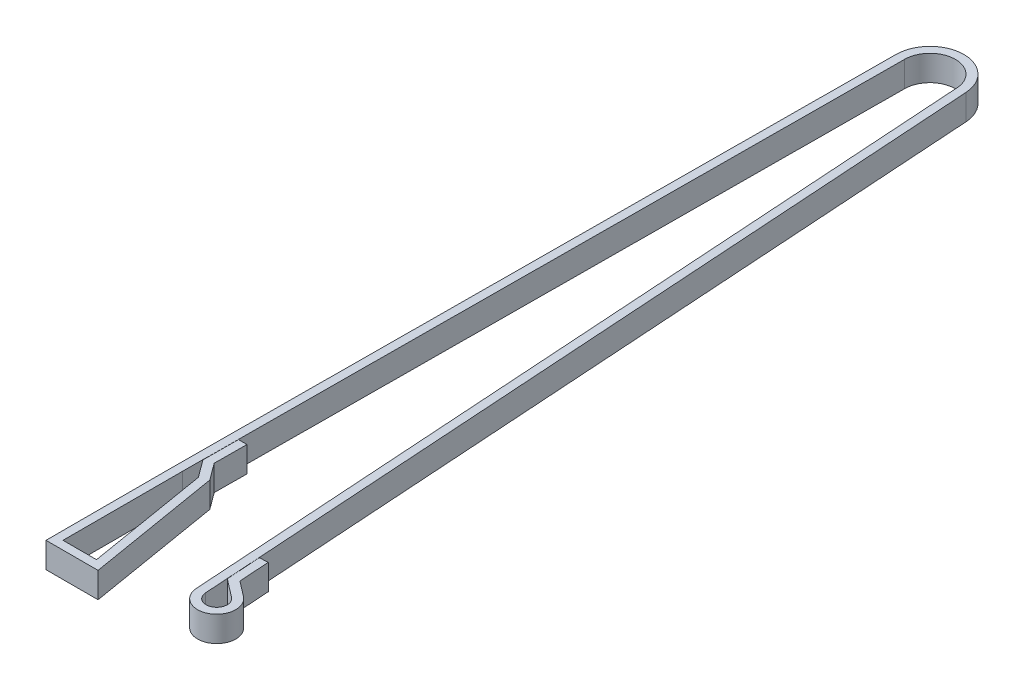
ISO-10303-21;
HEADER;
FILE_DESCRIPTION(('STEP AP214'),'2;1');
FILE_NAME('part.step','',(''),(''),'','','');
FILE_SCHEMA(('AUTOMOTIVE_DESIGN { 1 0 10303 214 1 1 1 1 }'));
ENDSEC;
DATA;
#1=APPLICATION_CONTEXT('core data for automotive mechanical design processes');
#2=APPLICATION_PROTOCOL_DEFINITION('international standard','automotive_design',2000,#1);
#3=PRODUCT_CONTEXT('',#1,'mechanical');
#4=PRODUCT('Part','Part','',(#3));
#5=PRODUCT_RELATED_PRODUCT_CATEGORY('part','',(#4));
#6=PRODUCT_DEFINITION_FORMATION('','',#4);
#7=PRODUCT_DEFINITION_CONTEXT('part definition',#1,'design');
#8=PRODUCT_DEFINITION('design','',#6,#7);
#9=PRODUCT_DEFINITION_SHAPE('','',#8);
#10=(LENGTH_UNIT() NAMED_UNIT(*) SI_UNIT(.MILLI.,.METRE.));
#11=(NAMED_UNIT(*) PLANE_ANGLE_UNIT() SI_UNIT($,.RADIAN.));
#12=(NAMED_UNIT(*) SI_UNIT($,.STERADIAN.) SOLID_ANGLE_UNIT());
#13=UNCERTAINTY_MEASURE_WITH_UNIT(LENGTH_MEASURE(1.E-05),#10,'distance_accuracy_value','');
#14=(GEOMETRIC_REPRESENTATION_CONTEXT(3) GLOBAL_UNCERTAINTY_ASSIGNED_CONTEXT((#13)) GLOBAL_UNIT_ASSIGNED_CONTEXT((#10,
#11,#12)) REPRESENTATION_CONTEXT('',''));
#15=CARTESIAN_POINT('',(0.,0.,0.));
#16=DIRECTION('',(0.,0.,1.));
#17=DIRECTION('',(1.,0.,0.));
#18=AXIS2_PLACEMENT_3D('',#15,#16,#17);
#19=CARTESIAN_POINT('',(3.07964569401571,-3.,-5.00171368797975));
#20=DIRECTION('',(0.99998249835892,0.,0.00591633128326256));
#21=DIRECTION('',(0.00591633128326256,0.,-0.99998249835892));
#22=AXIS2_PLACEMENT_3D('',#19,#20,#21);
#23=PLANE('',#22);
#24=DIRECTION('',(0.,1.,0.));
#25=VECTOR('',#24,1.);
#26=CARTESIAN_POINT('',(3.12697717266036,-3.,-13.0017136879798));
#27=LINE('',#26,#25);
#28=CARTESIAN_POINT('',(3.12697717266036,-3.,-13.0017136879798));
#29=VERTEX_POINT('',#28);
#30=CARTESIAN_POINT('',(3.12697717266036,3.,-13.0017136879798));
#31=VERTEX_POINT('',#30);
#32=EDGE_CURVE('E40',#29,#31,#27,.T.);
#33=ORIENTED_EDGE('',*,*,#32,.T.);
#34=DIRECTION('',(0.00591633128326256,0.,-0.99998249835892));
#35=VECTOR('',#34,1.);
#36=CARTESIAN_POINT('',(3.07964569401571,3.,-5.00171368797975));
#37=LINE('',#36,#35);
#38=CARTESIAN_POINT('',(3.08161084289808,3.,-5.33386454210851));
#39=VERTEX_POINT('',#38);
#40=EDGE_CURVE('E197',#39,#31,#37,.T.);
#41=ORIENTED_EDGE('',*,*,#40,.F.);
#42=DIRECTION('',(0.,1.,0.));
#43=VECTOR('',#42,1.);
#44=CARTESIAN_POINT('',(3.08161084289808,-3.,-5.33386454210851));
#45=LINE('',#44,#43);
#46=CARTESIAN_POINT('',(3.08161084289808,-3.,-5.33386454210851));
#47=VERTEX_POINT('',#46);
#48=EDGE_CURVE('E11',#47,#39,#45,.T.);
#49=ORIENTED_EDGE('',*,*,#48,.F.);
#50=DIRECTION('',(0.00591633128326256,0.,-0.99998249835892));
#51=VECTOR('',#50,1.);
#52=CARTESIAN_POINT('',(3.07964569401571,-3.,-5.00171368797975));
#53=LINE('',#52,#51);
#54=EDGE_CURVE('E198',#47,#29,#53,.T.);
#55=ORIENTED_EDGE('',*,*,#54,.T.);
#56=EDGE_LOOP('',(#33,#41,#49,#55));
#57=FACE_BOUND('',#56,.T.);
#58=ADVANCED_FACE('F37',(#57),#23,.T.);
#59=CARTESIAN_POINT('',(2.88445838565668,-3.,-5.60118263037093));
#60=DIRECTION('',(0.804795189999899,0.,-0.593552611107917));
#61=DIRECTION('',(-0.593552611107917,0.,-0.804795189999899));
#62=AXIS2_PLACEMENT_3D('',#59,#60,#61);
#63=PLANE('',#62);
#64=ORIENTED_EDGE('',*,*,#48,.T.);
#65=DIRECTION('',(-0.593552611107917,0.,-0.804795189999899));
#66=VECTOR('',#65,1.);
#67=CARTESIAN_POINT('',(2.88445838565668,3.,-5.60118263037093));
#68=LINE('',#67,#66);
#69=CARTESIAN_POINT('',(5.99443158082216,3.,-1.384384621807));
#70=VERTEX_POINT('',#69);
#71=EDGE_CURVE('E212',#70,#39,#68,.T.);
#72=ORIENTED_EDGE('',*,*,#71,.F.);
#73=DIRECTION('',(0.,1.,0.));
#74=VECTOR('',#73,1.);
#75=CARTESIAN_POINT('',(5.99443158082216,-3.,-1.384384621807));
#76=LINE('',#75,#74);
#77=CARTESIAN_POINT('',(5.99443158082216,-3.,-1.384384621807));
#78=VERTEX_POINT('',#77);
#79=EDGE_CURVE('E45',#78,#70,#76,.T.);
#80=ORIENTED_EDGE('',*,*,#79,.F.);
#81=DIRECTION('',(-0.593552611107917,0.,-0.804795189999899));
#82=VECTOR('',#81,1.);
#83=CARTESIAN_POINT('',(2.88445838565668,-3.,-5.60118263037093));
#84=LINE('',#83,#82);
#85=EDGE_CURVE('E203',#78,#47,#84,.T.);
#86=ORIENTED_EDGE('',*,*,#85,.T.);
#87=EDGE_LOOP('',(#64,#72,#80,#86));
#88=FACE_BOUND('',#87,.T.);
#89=ADVANCED_FACE('F471',(#88),#63,.T.);
#90=CARTESIAN_POINT('',(11.064429186573,-3.,29.0356010126946));
#91=DIRECTION('',(0.986393923832141,0.,-0.164398987305374));
#92=DIRECTION('',(-0.164398987305374,0.,-0.986393923832141));
#93=AXIS2_PLACEMENT_3D('',#90,#91,#92);
#94=PLANE('',#93);
#95=ORIENTED_EDGE('',*,*,#79,.T.);
#96=DIRECTION('',(-0.164398987305374,0.,-0.986393923832141));
#97=VECTOR('',#96,1.);
#98=CARTESIAN_POINT('',(11.064429186573,3.,29.0356010126946));
#99=LINE('',#98,#97);
#100=CARTESIAN_POINT('',(11.2584956844572,3.,30.2));
#101=VERTEX_POINT('',#100);
#102=EDGE_CURVE('E277',#101,#70,#99,.T.);
#103=ORIENTED_EDGE('',*,*,#102,.F.);
#104=DIRECTION('',(0.,1.,0.));
#105=VECTOR('',#104,1.);
#106=CARTESIAN_POINT('',(11.2584956844572,-3.,30.2));
#107=LINE('',#106,#105);
#108=CARTESIAN_POINT('',(11.2584956844572,-3.,30.2));
#109=VERTEX_POINT('',#108);
#110=EDGE_CURVE('E335',#109,#101,#107,.T.);
#111=ORIENTED_EDGE('',*,*,#110,.F.);
#112=DIRECTION('',(-0.164398987305374,0.,-0.986393923832141));
#113=VECTOR('',#112,1.);
#114=CARTESIAN_POINT('',(11.064429186573,-3.,29.0356010126946));
#115=LINE('',#114,#113);
#116=EDGE_CURVE('E331',#109,#78,#115,.T.);
#117=ORIENTED_EDGE('',*,*,#116,.T.);
#118=EDGE_LOOP('',(#95,#103,#111,#117));
#119=FACE_BOUND('',#118,.T.);
#120=ADVANCED_FACE('F469',(#119),#94,.T.);
#121=CARTESIAN_POINT('',(0.,-3.,30.2));
#122=DIRECTION('',(0.,0.,1.));
#123=DIRECTION('',(1.,0.,0.));
#124=AXIS2_PLACEMENT_3D('',#121,#122,#123);
#125=PLANE('',#124);
#126=ORIENTED_EDGE('',*,*,#110,.T.);
#127=DIRECTION('',(1.,0.,0.));
#128=VECTOR('',#127,1.);
#129=CARTESIAN_POINT('',(0.,3.,30.2));
#130=LINE('',#129,#128);
#131=CARTESIAN_POINT('',(-1.,3.,30.2));
#132=VERTEX_POINT('',#131);
#133=EDGE_CURVE('E274',#132,#101,#130,.T.);
#134=ORIENTED_EDGE('',*,*,#133,.F.);
#135=DIRECTION('',(0.,1.,0.));
#136=VECTOR('',#135,1.);
#137=CARTESIAN_POINT('',(-1.,-3.,30.2));
#138=LINE('',#137,#136);
#139=CARTESIAN_POINT('',(-1.,-3.,30.2));
#140=VERTEX_POINT('',#139);
#141=EDGE_CURVE('E337',#140,#132,#138,.T.);
#142=ORIENTED_EDGE('',*,*,#141,.F.);
#143=DIRECTION('',(1.,0.,0.));
#144=VECTOR('',#143,1.);
#145=CARTESIAN_POINT('',(0.,-3.,30.2));
#146=LINE('',#145,#144);
#147=EDGE_CURVE('E328',#140,#109,#146,.T.);
#148=ORIENTED_EDGE('',*,*,#147,.T.);
#149=EDGE_LOOP('',(#126,#134,#142,#148));
#150=FACE_BOUND('',#149,.T.);
#151=ADVANCED_FACE('F467',(#150),#125,.T.);
#152=CARTESIAN_POINT('',(-1.,-3.,29.2));
#153=DIRECTION('',(-1.,0.,0.));
#154=DIRECTION('',(0.,0.,1.));
#155=AXIS2_PLACEMENT_3D('',#152,#153,#154);
#156=PLANE('',#155);
#157=ORIENTED_EDGE('',*,*,#141,.T.);
#158=DIRECTION('',(0.,0.,-1.));
#159=VECTOR('',#158,1.);
#160=CARTESIAN_POINT('',(-1.,3.,29.2));
#161=LINE('',#160,#159);
#162=CARTESIAN_POINT('',(-1.,3.,-0.00295819152823111));
#163=VERTEX_POINT('',#162);
#164=EDGE_CURVE('E271',#163,#132,#161,.F.);
#165=ORIENTED_EDGE('',*,*,#164,.F.);
#166=DIRECTION('',(0.,1.,0.));
#167=VECTOR('',#166,1.);
#168=CARTESIAN_POINT('',(-1.,-3.,-0.00295819152823111));
#169=LINE('',#168,#167);
#170=CARTESIAN_POINT('',(-1.,-3.,-0.00295819152823111));
#171=VERTEX_POINT('',#170);
#172=EDGE_CURVE('E339',#171,#163,#169,.T.);
#173=ORIENTED_EDGE('',*,*,#172,.F.);
#174=DIRECTION('',(0.,0.,-1.));
#175=VECTOR('',#174,1.);
#176=CARTESIAN_POINT('',(-1.,-3.,29.2));
#177=LINE('',#176,#175);
#178=EDGE_CURVE('E325',#171,#140,#177,.F.);
#179=ORIENTED_EDGE('',*,*,#178,.T.);
#180=EDGE_LOOP('',(#157,#165,#173,#179));
#181=FACE_BOUND('',#180,.T.);
#182=ADVANCED_FACE('F462',(#181),#156,.T.);
#183=CARTESIAN_POINT('',(-0.99998249835892,-3.,-0.00591633128326235));
#184=DIRECTION('',(-0.99998249835892,0.,-0.00591633128326235));
#185=DIRECTION('',(-0.00591633128326235,0.,0.99998249835892));
#186=AXIS2_PLACEMENT_3D('',#183,#184,#185);
#187=PLANE('',#186);
#188=ORIENTED_EDGE('',*,*,#172,.T.);
#189=DIRECTION('',(-0.00591633128326235,0.,0.99998249835892));
#190=VECTOR('',#189,1.);
#191=CARTESIAN_POINT('',(-0.99998249835892,3.,-0.00591633128326235));
#192=LINE('',#191,#190);
#193=CARTESIAN_POINT('',(0.000140013128622574,3.,-169.047330650266));
#194=VERTEX_POINT('',#193);
#195=EDGE_CURVE('E268',#194,#163,#192,.T.);
#196=ORIENTED_EDGE('',*,*,#195,.F.);
#197=DIRECTION('',(0.,1.,0.));
#198=VECTOR('',#197,1.);
#199=CARTESIAN_POINT('',(0.000140013128622574,-3.,-169.047330650266));
#200=LINE('',#199,#198);
#201=CARTESIAN_POINT('',(0.000140013128622574,-3.,-169.047330650266));
#202=VERTEX_POINT('',#201);
#203=EDGE_CURVE('E341',#202,#194,#200,.T.);
#204=ORIENTED_EDGE('',*,*,#203,.F.);
#205=DIRECTION('',(-0.00591633128326235,0.,0.99998249835892));
#206=VECTOR('',#205,1.);
#207=CARTESIAN_POINT('',(-0.99998249835892,-3.,-0.00591633128326235));
#208=LINE('',#207,#206);
#209=EDGE_CURVE('E322',#202,#171,#208,.T.);
#210=ORIENTED_EDGE('',*,*,#209,.T.);
#211=EDGE_LOOP('',(#188,#196,#204,#210));
#212=FACE_BOUND('',#211,.T.);
#213=ADVANCED_FACE('F457',(#212),#187,.T.);
#214=CARTESIAN_POINT('',(7.99999999999998,-3.,-169.));
#215=DIRECTION('',(0.,1.,0.));
#216=DIRECTION('',(0.,0.,1.));
#217=AXIS2_PLACEMENT_3D('',#214,#215,#216);
#218=CYLINDRICAL_SURFACE('',#217,8.);
#219=ORIENTED_EDGE('',*,*,#203,.T.);
#220=CARTESIAN_POINT('',(7.99999999999998,3.,-169.));
#221=DIRECTION('',(0.,1.,0.));
#222=DIRECTION('',(1.,0.,0.));
#223=AXIS2_PLACEMENT_3D('',#220,#221,#222);
#224=CIRCLE('',#223,8.);
#225=CARTESIAN_POINT('',(15.9829835378534,3.,-169.521511106652));
#226=VERTEX_POINT('',#225);
#227=EDGE_CURVE('E265',#226,#194,#224,.T.);
#228=ORIENTED_EDGE('',*,*,#227,.F.);
#229=DIRECTION('',(0.,1.,0.));
#230=VECTOR('',#229,1.);
#231=CARTESIAN_POINT('',(15.9829835378534,-3.,-169.521511106652));
#232=LINE('',#231,#230);
#233=CARTESIAN_POINT('',(15.9829835378534,-3.,-169.521511106652));
#234=VERTEX_POINT('',#233);
#235=EDGE_CURVE('E343',#234,#226,#232,.T.);
#236=ORIENTED_EDGE('',*,*,#235,.F.);
#237=CARTESIAN_POINT('',(7.99999999999998,-3.,-169.));
#238=DIRECTION('',(0.,1.,0.));
#239=DIRECTION('',(1.,0.,0.));
#240=AXIS2_PLACEMENT_3D('',#237,#238,#239);
#241=CIRCLE('',#240,8.);
#242=EDGE_CURVE('E319',#234,#202,#241,.T.);
#243=ORIENTED_EDGE('',*,*,#242,.T.);
#244=EDGE_LOOP('',(#219,#228,#236,#243));
#245=FACE_BOUND('',#244,.T.);
#246=ADVANCED_FACE('F455',(#245),#218,.T.);
#247=CARTESIAN_POINT('',(15.9829835378534,-3.,-169.521511106652));
#248=DIRECTION('',(0.997872942231673,0.,-0.0651888883315628));
#249=DIRECTION('',(-0.0651888883315628,0.,-0.997872942231673));
#250=AXIS2_PLACEMENT_3D('',#247,#248,#249);
#251=PLANE('',#250);
#252=ORIENTED_EDGE('',*,*,#235,.T.);
#253=DIRECTION('',(-0.0651888883315628,0.,-0.997872942231673));
#254=VECTOR('',#253,1.);
#255=CARTESIAN_POINT('',(15.9829835378534,3.,-169.521511106652));
#256=LINE('',#255,#254);
#257=CARTESIAN_POINT('',(28.5053176444208,3.,22.162972220829));
#258=VERTEX_POINT('',#257);
#259=EDGE_CURVE('E262',#258,#226,#256,.T.);
#260=ORIENTED_EDGE('',*,*,#259,.F.);
#261=DIRECTION('',(0.,1.,0.));
#262=VECTOR('',#261,1.);
#263=CARTESIAN_POINT('',(28.5053176444208,-3.,22.162972220829));
#264=LINE('',#263,#262);
#265=CARTESIAN_POINT('',(28.5053176444208,-3.,22.162972220829));
#266=VERTEX_POINT('',#265);
#267=EDGE_CURVE('E345',#266,#258,#264,.T.);
#268=ORIENTED_EDGE('',*,*,#267,.F.);
#269=DIRECTION('',(-0.0651888883315628,0.,-0.997872942231673));
#270=VECTOR('',#269,1.);
#271=CARTESIAN_POINT('',(15.9829835378534,-3.,-169.521511106652));
#272=LINE('',#271,#270);
#273=EDGE_CURVE('E316',#266,#234,#272,.T.);
#274=ORIENTED_EDGE('',*,*,#273,.T.);
#275=EDGE_LOOP('',(#252,#260,#268,#274));
#276=FACE_BOUND('',#275,.T.);
#277=ADVANCED_FACE('F450',(#276),#251,.T.);
#278=CARTESIAN_POINT('',(31.,-3.,22.));
#279=DIRECTION('',(0.,1.,0.));
#280=DIRECTION('',(0.,0.,1.));
#281=AXIS2_PLACEMENT_3D('',#278,#279,#280);
#282=CYLINDRICAL_SURFACE('',#281,2.5);
#283=ORIENTED_EDGE('',*,*,#267,.T.);
#284=CARTESIAN_POINT('',(31.,3.,22.));
#285=DIRECTION('',(0.,1.,0.));
#286=DIRECTION('',(1.,0.,0.));
#287=AXIS2_PLACEMENT_3D('',#284,#285,#286);
#288=CIRCLE('',#287,2.5);
#289=CARTESIAN_POINT('',(32.5228272908472,3.,20.017325785145));
#290=VERTEX_POINT('',#289);
#291=EDGE_CURVE('E259',#290,#258,#288,.F.);
#292=ORIENTED_EDGE('',*,*,#291,.F.);
#293=DIRECTION('',(0.,1.,0.));
#294=VECTOR('',#293,1.);
#295=CARTESIAN_POINT('',(32.5228272908472,-3.,20.017325785145));
#296=LINE('',#295,#294);
#297=CARTESIAN_POINT('',(32.5228272908472,-3.,20.017325785145));
#298=VERTEX_POINT('',#297);
#299=EDGE_CURVE('E347',#298,#290,#296,.T.);
#300=ORIENTED_EDGE('',*,*,#299,.F.);
#301=CARTESIAN_POINT('',(31.,-3.,22.));
#302=DIRECTION('',(0.,1.,0.));
#303=DIRECTION('',(1.,0.,0.));
#304=AXIS2_PLACEMENT_3D('',#301,#302,#303);
#305=CIRCLE('',#304,2.5);
#306=EDGE_CURVE('E313',#298,#266,#305,.F.);
#307=ORIENTED_EDGE('',*,*,#306,.T.);
#308=EDGE_LOOP('',(#283,#292,#300,#307));
#309=FACE_BOUND('',#308,.T.);
#310=ADVANCED_FACE('F443',(#309),#282,.F.);
#311=CARTESIAN_POINT('',(32.5228272908472,-3.,20.017325785145));
#312=DIRECTION('',(-0.609130916338894,0.,0.793069685941998));
#313=DIRECTION('',(0.793069685941998,0.,0.609130916338894));
#314=AXIS2_PLACEMENT_3D('',#311,#312,#313);
#315=PLANE('',#314);
#316=ORIENTED_EDGE('',*,*,#299,.T.);
#317=DIRECTION('',(0.793069685941998,0.,0.609130916338894));
#318=VECTOR('',#317,1.);
#319=CARTESIAN_POINT('',(32.5228272908472,3.,20.017325785145));
#320=LINE('',#319,#318);
#321=CARTESIAN_POINT('',(28.1982636716494,3.,16.6957697518956));
#322=VERTEX_POINT('',#321);
#323=EDGE_CURVE('E256',#322,#290,#320,.T.);
#324=ORIENTED_EDGE('',*,*,#323,.F.);
#325=DIRECTION('',(0.,1.,0.));
#326=VECTOR('',#325,1.);
#327=CARTESIAN_POINT('',(28.1982636716494,-3.,16.6957697518956));
#328=LINE('',#327,#326);
#329=CARTESIAN_POINT('',(28.1982636716494,-3.,16.6957697518956));
#330=VERTEX_POINT('',#329);
#331=EDGE_CURVE('E349',#330,#322,#328,.T.);
#332=ORIENTED_EDGE('',*,*,#331,.F.);
#333=DIRECTION('',(0.793069685941998,0.,0.609130916338894));
#334=VECTOR('',#333,1.);
#335=CARTESIAN_POINT('',(32.5228272908472,-3.,20.017325785145));
#336=LINE('',#335,#334);
#337=EDGE_CURVE('E310',#330,#298,#336,.T.);
#338=ORIENTED_EDGE('',*,*,#337,.T.);
#339=EDGE_LOOP('',(#316,#324,#332,#338));
#340=FACE_BOUND('',#339,.T.);
#341=ADVANCED_FACE('F439',(#340),#315,.T.);
#342=CARTESIAN_POINT('',(28.1687368352445,-3.,16.2437904058401));
#343=DIRECTION('',(-0.997872942231673,0.,0.0651888883315624));
#344=DIRECTION('',(0.0651888883315624,0.,0.997872942231673));
#345=AXIS2_PLACEMENT_3D('',#342,#343,#344);
#346=PLANE('',#345);
#347=ORIENTED_EDGE('',*,*,#331,.T.);
#348=DIRECTION('',(0.0651888883315624,0.,0.997872942231673));
#349=VECTOR('',#348,1.);
#350=CARTESIAN_POINT('',(28.1687368352445,3.,16.2437904058401));
#351=LINE('',#350,#349);
#352=CARTESIAN_POINT('',(27.6720464693703,3.,8.64074808592587));
#353=VERTEX_POINT('',#352);
#354=EDGE_CURVE('E253',#353,#322,#351,.T.);
#355=ORIENTED_EDGE('',*,*,#354,.F.);
#356=DIRECTION('',(0.,1.,0.));
#357=VECTOR('',#356,1.);
#358=CARTESIAN_POINT('',(27.6720464693703,-3.,8.64074808592587));
#359=LINE('',#358,#357);
#360=CARTESIAN_POINT('',(27.6720464693703,-3.,8.64074808592587));
#361=VERTEX_POINT('',#360);
#362=EDGE_CURVE('E351',#361,#353,#359,.T.);
#363=ORIENTED_EDGE('',*,*,#362,.F.);
#364=DIRECTION('',(0.0651888883315624,0.,0.997872942231673));
#365=VECTOR('',#364,1.);
#366=CARTESIAN_POINT('',(28.1687368352445,-3.,16.2437904058401));
#367=LINE('',#366,#365);
#368=EDGE_CURVE('E307',#361,#330,#367,.T.);
#369=ORIENTED_EDGE('',*,*,#368,.T.);
#370=EDGE_LOOP('',(#347,#355,#363,#369));
#371=FACE_BOUND('',#370,.T.);
#372=ADVANCED_FACE('F435',(#371),#346,.T.);
#373=CARTESIAN_POINT('',(27.6720464693703,-3.,8.64074808592587));
#374=DIRECTION('',(0.0651888883315619,0.,0.997872942231673));
#375=DIRECTION('',(0.997872942231673,0.,-0.0651888883315619));
#376=AXIS2_PLACEMENT_3D('',#373,#374,#375);
#377=PLANE('',#376);
#378=ORIENTED_EDGE('',*,*,#362,.T.);
#379=DIRECTION('',(0.997872942231673,0.,-0.0651888883315619));
#380=VECTOR('',#379,1.);
#381=CARTESIAN_POINT('',(27.6720464693703,3.,8.64074808592587));
#382=LINE('',#381,#380);
#383=CARTESIAN_POINT('',(29.6677923538336,3.,8.51037030926275));
#384=VERTEX_POINT('',#383);
#385=EDGE_CURVE('E250',#353,#384,#382,.T.);
#386=ORIENTED_EDGE('',*,*,#385,.T.);
#387=DIRECTION('',(0.,1.,0.));
#388=VECTOR('',#387,1.);
#389=CARTESIAN_POINT('',(29.6677923538336,-3.,8.51037030926275));
#390=LINE('',#389,#388);
#391=CARTESIAN_POINT('',(29.6677923538336,-3.,8.51037030926275));
#392=VERTEX_POINT('',#391);
#393=EDGE_CURVE('E353',#392,#384,#390,.T.);
#394=ORIENTED_EDGE('',*,*,#393,.F.);
#395=DIRECTION('',(0.997872942231673,0.,-0.0651888883315619));
#396=VECTOR('',#395,1.);
#397=CARTESIAN_POINT('',(27.6720464693703,-3.,8.64074808592587));
#398=LINE('',#397,#396);
#399=EDGE_CURVE('E305',#361,#392,#398,.T.);
#400=ORIENTED_EDGE('',*,*,#399,.F.);
#401=EDGE_LOOP('',(#378,#386,#394,#400));
#402=FACE_BOUND('',#401,.T.);
#403=ADVANCED_FACE('F430',(#402),#377,.F.);
#404=CARTESIAN_POINT('',(30.1644827197078,-3.,16.113412629177));
#405=DIRECTION('',(-0.997872942231673,0.,0.0651888883315624));
#406=DIRECTION('',(0.0651888883315624,0.,0.997872942231673));
#407=AXIS2_PLACEMENT_3D('',#404,#405,#406);
#408=PLANE('',#407);
#409=ORIENTED_EDGE('',*,*,#393,.T.);
#410=DIRECTION('',(0.0651888883315624,0.,0.997872942231673));
#411=VECTOR('',#410,1.);
#412=CARTESIAN_POINT('',(30.1644827197078,3.,16.113412629177));
#413=LINE('',#412,#411);
#414=CARTESIAN_POINT('',(30.1349558833029,3.,15.6614332831214));
#415=VERTEX_POINT('',#414);
#416=EDGE_CURVE('E247',#384,#415,#413,.T.);
#417=ORIENTED_EDGE('',*,*,#416,.T.);
#418=DIRECTION('',(0.,1.,0.));
#419=VECTOR('',#418,1.);
#420=CARTESIAN_POINT('',(30.1349558833029,-3.,15.6614332831214));
#421=LINE('',#420,#419);
#422=CARTESIAN_POINT('',(30.1349558833029,-3.,15.6614332831214));
#423=VERTEX_POINT('',#422);
#424=EDGE_CURVE('E355',#423,#415,#421,.T.);
#425=ORIENTED_EDGE('',*,*,#424,.F.);
#426=DIRECTION('',(0.0651888883315624,0.,0.997872942231673));
#427=VECTOR('',#426,1.);
#428=CARTESIAN_POINT('',(30.1644827197078,-3.,16.113412629177));
#429=LINE('',#428,#427);
#430=EDGE_CURVE('E303',#392,#423,#429,.T.);
#431=ORIENTED_EDGE('',*,*,#430,.F.);
#432=EDGE_LOOP('',(#409,#417,#425,#431));
#433=FACE_BOUND('',#432,.T.);
#434=ADVANCED_FACE('F426',(#433),#408,.F.);
#435=CARTESIAN_POINT('',(33.741089123525,-3.,18.431186413261));
#436=DIRECTION('',(-0.609130916338894,0.,0.793069685941998));
#437=DIRECTION('',(0.793069685941998,0.,0.609130916338894));
#438=AXIS2_PLACEMENT_3D('',#435,#436,#437);
#439=PLANE('',#438);
#440=ORIENTED_EDGE('',*,*,#424,.T.);
#441=DIRECTION('',(0.793069685941998,0.,0.609130916338894));
#442=VECTOR('',#441,1.);
#443=CARTESIAN_POINT('',(33.741089123525,3.,18.431186413261));
#444=LINE('',#443,#442);
#445=CARTESIAN_POINT('',(33.741089123525,3.,18.431186413261));
#446=VERTEX_POINT('',#445);
#447=EDGE_CURVE('E244',#415,#446,#444,.T.);
#448=ORIENTED_EDGE('',*,*,#447,.T.);
#449=DIRECTION('',(0.,1.,0.));
#450=VECTOR('',#449,1.);
#451=CARTESIAN_POINT('',(33.741089123525,-3.,18.431186413261));
#452=LINE('',#451,#450);
#453=CARTESIAN_POINT('',(33.741089123525,-3.,18.431186413261));
#454=VERTEX_POINT('',#453);
#455=EDGE_CURVE('E357',#454,#446,#452,.T.);
#456=ORIENTED_EDGE('',*,*,#455,.F.);
#457=DIRECTION('',(0.793069685941998,0.,0.609130916338894));
#458=VECTOR('',#457,1.);
#459=CARTESIAN_POINT('',(33.741089123525,-3.,18.431186413261));
#460=LINE('',#459,#458);
#461=EDGE_CURVE('E301',#423,#454,#460,.T.);
#462=ORIENTED_EDGE('',*,*,#461,.F.);
#463=EDGE_LOOP('',(#440,#448,#456,#462));
#464=FACE_BOUND('',#463,.T.);
#465=ADVANCED_FACE('F421',(#464),#439,.F.);
#466=CARTESIAN_POINT('',(31.,-3.,22.));
#467=DIRECTION('',(0.,1.,0.));
#468=DIRECTION('',(0.,0.,1.));
#469=AXIS2_PLACEMENT_3D('',#466,#467,#468);
#470=CYLINDRICAL_SURFACE('',#469,4.5);
#471=ORIENTED_EDGE('',*,*,#455,.T.);
#472=CARTESIAN_POINT('',(31.,3.,22.));
#473=DIRECTION('',(0.,1.,0.));
#474=DIRECTION('',(1.,0.,0.));
#475=AXIS2_PLACEMENT_3D('',#472,#473,#474);
#476=CIRCLE('',#475,4.5);
#477=CARTESIAN_POINT('',(26.5095717599575,3.,22.2933499974921));
#478=VERTEX_POINT('',#477);
#479=EDGE_CURVE('E241',#446,#478,#476,.F.);
#480=ORIENTED_EDGE('',*,*,#479,.T.);
#481=DIRECTION('',(0.,1.,0.));
#482=VECTOR('',#481,1.);
#483=CARTESIAN_POINT('',(26.5095717599575,-3.,22.2933499974921));
#484=LINE('',#483,#482);
#485=CARTESIAN_POINT('',(26.5095717599575,-3.,22.2933499974921));
#486=VERTEX_POINT('',#485);
#487=EDGE_CURVE('E359',#486,#478,#484,.T.);
#488=ORIENTED_EDGE('',*,*,#487,.F.);
#489=CARTESIAN_POINT('',(31.,-3.,22.));
#490=DIRECTION('',(0.,1.,0.));
#491=DIRECTION('',(1.,0.,0.));
#492=AXIS2_PLACEMENT_3D('',#489,#490,#491);
#493=CIRCLE('',#492,4.5);
#494=EDGE_CURVE('E299',#454,#486,#493,.F.);
#495=ORIENTED_EDGE('',*,*,#494,.F.);
#496=EDGE_LOOP('',(#471,#480,#488,#495));
#497=FACE_BOUND('',#496,.T.);
#498=ADVANCED_FACE('F416',(#497),#470,.T.);
#499=CARTESIAN_POINT('',(13.98723765339,-3.,-169.391133329989));
#500=DIRECTION('',(0.997872942231673,0.,-0.0651888883315628));
#501=DIRECTION('',(-0.0651888883315628,0.,-0.997872942231673));
#502=AXIS2_PLACEMENT_3D('',#499,#500,#501);
#503=PLANE('',#502);
#504=ORIENTED_EDGE('',*,*,#487,.T.);
#505=DIRECTION('',(-0.0651888883315628,0.,-0.997872942231673));
#506=VECTOR('',#505,1.);
#507=CARTESIAN_POINT('',(13.98723765339,3.,-169.391133329989));
#508=LINE('',#507,#506);
#509=CARTESIAN_POINT('',(13.98723765339,3.,-169.391133329989));
#510=VERTEX_POINT('',#509);
#511=EDGE_CURVE('E238',#478,#510,#508,.T.);
#512=ORIENTED_EDGE('',*,*,#511,.T.);
#513=DIRECTION('',(0.,1.,0.));
#514=VECTOR('',#513,1.);
#515=CARTESIAN_POINT('',(13.98723765339,-3.,-169.391133329989));
#516=LINE('',#515,#514);
#517=CARTESIAN_POINT('',(13.98723765339,-3.,-169.391133329989));
#518=VERTEX_POINT('',#517);
#519=EDGE_CURVE('E361',#518,#510,#516,.T.);
#520=ORIENTED_EDGE('',*,*,#519,.F.);
#521=DIRECTION('',(-0.0651888883315628,0.,-0.997872942231673));
#522=VECTOR('',#521,1.);
#523=CARTESIAN_POINT('',(13.98723765339,-3.,-169.391133329989));
#524=LINE('',#523,#522);
#525=EDGE_CURVE('E297',#486,#518,#524,.T.);
#526=ORIENTED_EDGE('',*,*,#525,.F.);
#527=EDGE_LOOP('',(#504,#512,#520,#526));
#528=FACE_BOUND('',#527,.T.);
#529=ADVANCED_FACE('F411',(#528),#503,.F.);
#530=CARTESIAN_POINT('',(7.99999999999998,-3.,-169.));
#531=DIRECTION('',(0.,1.,0.));
#532=DIRECTION('',(0.,0.,1.));
#533=AXIS2_PLACEMENT_3D('',#530,#531,#532);
#534=CYLINDRICAL_SURFACE('',#533,6.);
#535=ORIENTED_EDGE('',*,*,#519,.T.);
#536=CARTESIAN_POINT('',(7.99999999999998,3.,-169.));
#537=DIRECTION('',(0.,1.,0.));
#538=DIRECTION('',(1.,0.,0.));
#539=AXIS2_PLACEMENT_3D('',#536,#537,#538);
#540=CIRCLE('',#539,6.);
#541=CARTESIAN_POINT('',(2.00010500984646,3.,-169.0354979877));
#542=VERTEX_POINT('',#541);
#543=EDGE_CURVE('E235',#510,#542,#540,.T.);
#544=ORIENTED_EDGE('',*,*,#543,.T.);
#545=DIRECTION('',(0.,1.,0.));
#546=VECTOR('',#545,1.);
#547=CARTESIAN_POINT('',(2.00010500984646,-3.,-169.0354979877));
#548=LINE('',#547,#546);
#549=CARTESIAN_POINT('',(2.00010500984646,-3.,-169.0354979877));
#550=VERTEX_POINT('',#549);
#551=EDGE_CURVE('E363',#550,#542,#548,.T.);
#552=ORIENTED_EDGE('',*,*,#551,.F.);
#553=CARTESIAN_POINT('',(7.99999999999998,-3.,-169.));
#554=DIRECTION('',(0.,1.,0.));
#555=DIRECTION('',(1.,0.,0.));
#556=AXIS2_PLACEMENT_3D('',#553,#554,#555);
#557=CIRCLE('',#556,6.);
#558=EDGE_CURVE('E295',#518,#550,#557,.T.);
#559=ORIENTED_EDGE('',*,*,#558,.F.);
#560=EDGE_LOOP('',(#535,#544,#552,#559));
#561=FACE_BOUND('',#560,.T.);
#562=ADVANCED_FACE('F406',(#561),#534,.F.);
#563=CARTESIAN_POINT('',(0.99998249835892,-3.,0.00591633128326235));
#564=DIRECTION('',(-0.99998249835892,0.,-0.00591633128326235));
#565=DIRECTION('',(-0.00591633128326235,0.,0.99998249835892));
#566=AXIS2_PLACEMENT_3D('',#563,#564,#565);
#567=PLANE('',#566);
#568=ORIENTED_EDGE('',*,*,#551,.T.);
#569=DIRECTION('',(-0.00591633128326235,0.,0.99998249835892));
#570=VECTOR('',#569,1.);
#571=CARTESIAN_POINT('',(0.99998249835892,3.,0.00591633128326235));
#572=LINE('',#571,#570);
#573=CARTESIAN_POINT('',(1.,3.,0.00295819152823111));
#574=VERTEX_POINT('',#573);
#575=EDGE_CURVE('E232',#542,#574,#572,.T.);
#576=ORIENTED_EDGE('',*,*,#575,.T.);
#577=DIRECTION('',(0.,1.,0.));
#578=VECTOR('',#577,1.);
#579=CARTESIAN_POINT('',(1.,-3.,0.00295819152823111));
#580=LINE('',#579,#578);
#581=CARTESIAN_POINT('',(1.,-3.,0.00295819152823111));
#582=VERTEX_POINT('',#581);
#583=EDGE_CURVE('E365',#582,#574,#580,.T.);
#584=ORIENTED_EDGE('',*,*,#583,.F.);
#585=DIRECTION('',(-0.00591633128326235,0.,0.99998249835892));
#586=VECTOR('',#585,1.);
#587=CARTESIAN_POINT('',(0.99998249835892,-3.,0.00591633128326235));
#588=LINE('',#587,#586);
#589=EDGE_CURVE('E293',#550,#582,#588,.T.);
#590=ORIENTED_EDGE('',*,*,#589,.F.);
#591=EDGE_LOOP('',(#568,#576,#584,#590));
#592=FACE_BOUND('',#591,.T.);
#593=ADVANCED_FACE('F401',(#592),#567,.F.);
#594=CARTESIAN_POINT('',(1.,-3.,29.2));
#595=DIRECTION('',(-1.,0.,0.));
#596=DIRECTION('',(0.,0.,1.));
#597=AXIS2_PLACEMENT_3D('',#594,#595,#596);
#598=PLANE('',#597);
#599=ORIENTED_EDGE('',*,*,#583,.T.);
#600=DIRECTION('',(0.,0.,-1.));
#601=VECTOR('',#600,1.);
#602=CARTESIAN_POINT('',(1.,3.,29.2));
#603=LINE('',#602,#601);
#604=CARTESIAN_POINT('',(1.,3.,28.2));
#605=VERTEX_POINT('',#604);
#606=EDGE_CURVE('E229',#574,#605,#603,.F.);
#607=ORIENTED_EDGE('',*,*,#606,.T.);
#608=DIRECTION('',(0.,1.,0.));
#609=VECTOR('',#608,1.);
#610=CARTESIAN_POINT('',(1.,-3.,28.2));
#611=LINE('',#610,#609);
#612=CARTESIAN_POINT('',(1.,-3.,28.2));
#613=VERTEX_POINT('',#612);
#614=EDGE_CURVE('E367',#613,#605,#611,.T.);
#615=ORIENTED_EDGE('',*,*,#614,.F.);
#616=DIRECTION('',(0.,0.,-1.));
#617=VECTOR('',#616,1.);
#618=CARTESIAN_POINT('',(1.,-3.,29.2));
#619=LINE('',#618,#617);
#620=EDGE_CURVE('E291',#582,#613,#619,.F.);
#621=ORIENTED_EDGE('',*,*,#620,.F.);
#622=EDGE_LOOP('',(#599,#607,#615,#621));
#623=FACE_BOUND('',#622,.T.);
#624=ADVANCED_FACE('F396',(#623),#598,.F.);
#625=CARTESIAN_POINT('',(0.,-3.,28.2));
#626=DIRECTION('',(0.,0.,1.));
#627=DIRECTION('',(1.,0.,0.));
#628=AXIS2_PLACEMENT_3D('',#625,#626,#627);
#629=PLANE('',#628);
#630=ORIENTED_EDGE('',*,*,#614,.T.);
#631=DIRECTION('',(1.,0.,0.));
#632=VECTOR('',#631,1.);
#633=CARTESIAN_POINT('',(0.,3.,28.2));
#634=LINE('',#633,#632);
#635=CARTESIAN_POINT('',(8.89757484102442,3.,28.2));
#636=VERTEX_POINT('',#635);
#637=EDGE_CURVE('E226',#605,#636,#634,.T.);
#638=ORIENTED_EDGE('',*,*,#637,.T.);
#639=DIRECTION('',(0.,1.,0.));
#640=VECTOR('',#639,1.);
#641=CARTESIAN_POINT('',(8.89757484102442,-3.,28.2));
#642=LINE('',#641,#640);
#643=CARTESIAN_POINT('',(8.89757484102442,-3.,28.2));
#644=VERTEX_POINT('',#643);
#645=EDGE_CURVE('E369',#644,#636,#642,.T.);
#646=ORIENTED_EDGE('',*,*,#645,.F.);
#647=DIRECTION('',(1.,0.,0.));
#648=VECTOR('',#647,1.);
#649=CARTESIAN_POINT('',(0.,-3.,28.2));
#650=LINE('',#649,#648);
#651=EDGE_CURVE('E289',#613,#644,#650,.T.);
#652=ORIENTED_EDGE('',*,*,#651,.F.);
#653=EDGE_LOOP('',(#630,#638,#646,#652));
#654=FACE_BOUND('',#653,.T.);
#655=ADVANCED_FACE('F391',(#654),#629,.F.);
#656=CARTESIAN_POINT('',(9.09164133890867,-3.,29.3643989873054));
#657=DIRECTION('',(0.986393923832141,0.,-0.164398987305374));
#658=DIRECTION('',(-0.164398987305374,0.,-0.986393923832141));
#659=AXIS2_PLACEMENT_3D('',#656,#657,#658);
#660=PLANE('',#659);
#661=ORIENTED_EDGE('',*,*,#645,.T.);
#662=DIRECTION('',(-0.164398987305374,0.,-0.986393923832141));
#663=VECTOR('',#662,1.);
#664=CARTESIAN_POINT('',(9.09164133890867,3.,29.3643989873054));
#665=LINE('',#664,#663);
#666=CARTESIAN_POINT('',(4.10042092157059,3.,-0.582923516720043));
#667=VERTEX_POINT('',#666);
#668=EDGE_CURVE('E223',#636,#667,#665,.T.);
#669=ORIENTED_EDGE('',*,*,#668,.T.);
#670=DIRECTION('',(0.,1.,0.));
#671=VECTOR('',#670,1.);
#672=CARTESIAN_POINT('',(4.10042092157059,-3.,-0.582923516720043));
#673=LINE('',#672,#671);
#674=CARTESIAN_POINT('',(4.10042092157059,-3.,-0.582923516720043));
#675=VERTEX_POINT('',#674);
#676=EDGE_CURVE('E371',#675,#667,#673,.T.);
#677=ORIENTED_EDGE('',*,*,#676,.F.);
#678=DIRECTION('',(-0.164398987305374,0.,-0.986393923832141));
#679=VECTOR('',#678,1.);
#680=CARTESIAN_POINT('',(9.09164133890867,-3.,29.3643989873054));
#681=LINE('',#680,#679);
#682=EDGE_CURVE('E287',#644,#675,#681,.T.);
#683=ORIENTED_EDGE('',*,*,#682,.F.);
#684=EDGE_LOOP('',(#661,#669,#677,#683));
#685=FACE_BOUND('',#684,.T.);
#686=ADVANCED_FACE('F386',(#685),#660,.F.);
#687=CARTESIAN_POINT('',(1.27486800565689,-3.,-4.4140774081551));
#688=DIRECTION('',(0.804795189999899,0.,-0.593552611107917));
#689=DIRECTION('',(-0.593552611107917,0.,-0.804795189999899));
#690=AXIS2_PLACEMENT_3D('',#687,#688,#689);
#691=PLANE('',#690);
#692=ORIENTED_EDGE('',*,*,#676,.T.);
#693=DIRECTION('',(-0.593552611107917,0.,-0.804795189999899));
#694=VECTOR('',#693,1.);
#695=CARTESIAN_POINT('',(1.27486800565689,3.,-4.4140774081551));
#696=LINE('',#695,#694);
#697=CARTESIAN_POINT('',(1.07771554841549,3.,-4.68139549641752));
#698=VERTEX_POINT('',#697);
#699=EDGE_CURVE('E218',#667,#698,#696,.T.);
#700=ORIENTED_EDGE('',*,*,#699,.T.);
#701=DIRECTION('',(0.,1.,0.));
#702=VECTOR('',#701,1.);
#703=CARTESIAN_POINT('',(1.07771554841549,-3.,-4.68139549641752));
#704=LINE('',#703,#702);
#705=CARTESIAN_POINT('',(1.07771554841549,-3.,-4.68139549641752));
#706=VERTEX_POINT('',#705);
#707=EDGE_CURVE('E373',#706,#698,#704,.T.);
#708=ORIENTED_EDGE('',*,*,#707,.F.);
#709=DIRECTION('',(-0.593552611107917,0.,-0.804795189999899));
#710=VECTOR('',#709,1.);
#711=CARTESIAN_POINT('',(1.27486800565689,-3.,-4.4140774081551));
#712=LINE('',#711,#710);
#713=EDGE_CURVE('E285',#675,#706,#712,.T.);
#714=ORIENTED_EDGE('',*,*,#713,.F.);
#715=EDGE_LOOP('',(#692,#700,#708,#714));
#716=FACE_BOUND('',#715,.T.);
#717=ADVANCED_FACE('F382',(#716),#691,.F.);
#718=CARTESIAN_POINT('',(1.07968069729787,-3.,-5.01354635054628));
#719=DIRECTION('',(0.99998249835892,0.,0.00591633128326256));
#720=DIRECTION('',(0.00591633128326256,0.,-0.99998249835892));
#721=AXIS2_PLACEMENT_3D('',#718,#719,#720);
#722=PLANE('',#721);
#723=ORIENTED_EDGE('',*,*,#707,.T.);
#724=DIRECTION('',(0.00591633128326256,0.,-0.99998249835892));
#725=VECTOR('',#724,1.);
#726=CARTESIAN_POINT('',(1.07968069729787,3.,-5.01354635054628));
#727=LINE('',#726,#725);
#728=CARTESIAN_POINT('',(1.12701217594252,3.,-13.0135463505463));
#729=VERTEX_POINT('',#728);
#730=EDGE_CURVE('E216',#698,#729,#727,.T.);
#731=ORIENTED_EDGE('',*,*,#730,.T.);
#732=DIRECTION('',(0.,1.,0.));
#733=VECTOR('',#732,1.);
#734=CARTESIAN_POINT('',(1.12701217594252,-3.,-13.0135463505463));
#735=LINE('',#734,#733);
#736=CARTESIAN_POINT('',(1.12701217594252,-3.,-13.0135463505463));
#737=VERTEX_POINT('',#736);
#738=EDGE_CURVE('E202',#737,#729,#735,.T.);
#739=ORIENTED_EDGE('',*,*,#738,.F.);
#740=DIRECTION('',(0.00591633128326256,0.,-0.99998249835892));
#741=VECTOR('',#740,1.);
#742=CARTESIAN_POINT('',(1.07968069729787,-3.,-5.01354635054628));
#743=LINE('',#742,#741);
#744=EDGE_CURVE('E283',#706,#737,#743,.T.);
#745=ORIENTED_EDGE('',*,*,#744,.F.);
#746=EDGE_LOOP('',(#723,#731,#739,#745));
#747=FACE_BOUND('',#746,.T.);
#748=ADVANCED_FACE('F377',(#747),#722,.F.);
#749=CARTESIAN_POINT('',(1.12701217594252,-3.,-13.0135463505463));
#750=DIRECTION('',(-0.00591633128326288,0.,0.99998249835892));
#751=DIRECTION('',(0.99998249835892,0.,0.00591633128326288));
#752=AXIS2_PLACEMENT_3D('',#749,#750,#751);
#753=PLANE('',#752);
#754=ORIENTED_EDGE('',*,*,#738,.T.);
#755=DIRECTION('',(0.99998249835892,0.,0.00591633128326288));
#756=VECTOR('',#755,1.);
#757=CARTESIAN_POINT('',(1.12701217594252,3.,-13.0135463505463));
#758=LINE('',#757,#756);
#759=EDGE_CURVE('E209',#729,#31,#758,.T.);
#760=ORIENTED_EDGE('',*,*,#759,.T.);
#761=ORIENTED_EDGE('',*,*,#32,.F.);
#762=DIRECTION('',(0.99998249835892,0.,0.00591633128326288));
#763=VECTOR('',#762,1.);
#764=CARTESIAN_POINT('',(1.12701217594252,-3.,-13.0135463505463));
#765=LINE('',#764,#763);
#766=EDGE_CURVE('E281',#737,#29,#765,.T.);
#767=ORIENTED_EDGE('',*,*,#766,.F.);
#768=EDGE_LOOP('',(#754,#760,#761,#767));
#769=FACE_BOUND('',#768,.T.);
#770=ADVANCED_FACE('F214',(#769),#753,.F.);
#771=CARTESIAN_POINT('',(7.99999999999998,-3.,-169.));
#772=DIRECTION('',(0.,1.,0.));
#773=DIRECTION('',(1.,0.,0.));
#774=AXIS2_PLACEMENT_3D('',#771,#772,#773);
#775=PLANE('',#774);
#776=ORIENTED_EDGE('',*,*,#54,.F.);
#777=ORIENTED_EDGE('',*,*,#85,.F.);
#778=ORIENTED_EDGE('',*,*,#116,.F.);
#779=ORIENTED_EDGE('',*,*,#147,.F.);
#780=ORIENTED_EDGE('',*,*,#178,.F.);
#781=ORIENTED_EDGE('',*,*,#209,.F.);
#782=ORIENTED_EDGE('',*,*,#242,.F.);
#783=ORIENTED_EDGE('',*,*,#273,.F.);
#784=ORIENTED_EDGE('',*,*,#306,.F.);
#785=ORIENTED_EDGE('',*,*,#337,.F.);
#786=ORIENTED_EDGE('',*,*,#368,.F.);
#787=ORIENTED_EDGE('',*,*,#399,.T.);
#788=ORIENTED_EDGE('',*,*,#430,.T.);
#789=ORIENTED_EDGE('',*,*,#461,.T.);
#790=ORIENTED_EDGE('',*,*,#494,.T.);
#791=ORIENTED_EDGE('',*,*,#525,.T.);
#792=ORIENTED_EDGE('',*,*,#558,.T.);
#793=ORIENTED_EDGE('',*,*,#589,.T.);
#794=ORIENTED_EDGE('',*,*,#620,.T.);
#795=ORIENTED_EDGE('',*,*,#651,.T.);
#796=ORIENTED_EDGE('',*,*,#682,.T.);
#797=ORIENTED_EDGE('',*,*,#713,.T.);
#798=ORIENTED_EDGE('',*,*,#744,.T.);
#799=ORIENTED_EDGE('',*,*,#766,.T.);
#800=EDGE_LOOP('',(#776,#777,#778,#779,#780,#781,#782,#783,#784,#785,#786,#787,#788,#789,#790,
#791,#792,#793,#794,#795,#796,#797,#798,#799));
#801=FACE_BOUND('',#800,.T.);
#802=ADVANCED_FACE('F446',(#801),#775,.F.);
#803=CARTESIAN_POINT('',(7.99999999999998,3.,-169.));
#804=DIRECTION('',(0.,1.,0.));
#805=DIRECTION('',(1.,0.,0.));
#806=AXIS2_PLACEMENT_3D('',#803,#804,#805);
#807=PLANE('',#806);
#808=ORIENTED_EDGE('',*,*,#40,.T.);
#809=ORIENTED_EDGE('',*,*,#759,.F.);
#810=ORIENTED_EDGE('',*,*,#730,.F.);
#811=ORIENTED_EDGE('',*,*,#699,.F.);
#812=ORIENTED_EDGE('',*,*,#668,.F.);
#813=ORIENTED_EDGE('',*,*,#637,.F.);
#814=ORIENTED_EDGE('',*,*,#606,.F.);
#815=ORIENTED_EDGE('',*,*,#575,.F.);
#816=ORIENTED_EDGE('',*,*,#543,.F.);
#817=ORIENTED_EDGE('',*,*,#511,.F.);
#818=ORIENTED_EDGE('',*,*,#479,.F.);
#819=ORIENTED_EDGE('',*,*,#447,.F.);
#820=ORIENTED_EDGE('',*,*,#416,.F.);
#821=ORIENTED_EDGE('',*,*,#385,.F.);
#822=ORIENTED_EDGE('',*,*,#354,.T.);
#823=ORIENTED_EDGE('',*,*,#323,.T.);
#824=ORIENTED_EDGE('',*,*,#291,.T.);
#825=ORIENTED_EDGE('',*,*,#259,.T.);
#826=ORIENTED_EDGE('',*,*,#227,.T.);
#827=ORIENTED_EDGE('',*,*,#195,.T.);
#828=ORIENTED_EDGE('',*,*,#164,.T.);
#829=ORIENTED_EDGE('',*,*,#133,.T.);
#830=ORIENTED_EDGE('',*,*,#102,.T.);
#831=ORIENTED_EDGE('',*,*,#71,.T.);
#832=EDGE_LOOP('',(#808,#809,#810,#811,#812,#813,#814,#815,#816,#817,#818,#819,#820,#821,#822,
#823,#824,#825,#826,#827,#828,#829,#830,#831));
#833=FACE_BOUND('',#832,.T.);
#834=ADVANCED_FACE('F207',(#833),#807,.T.);
#835=CLOSED_SHELL('',(#58,#89,#120,#151,#182,#213,#246,#277,#310,#341,#372,#403,#434,#465,#498,
#529,#562,#593,#624,#655,#686,#717,#748,#770,#802,#834));
#836=MANIFOLD_SOLID_BREP('B2',#835);
#837=ADVANCED_BREP_SHAPE_REPRESENTATION('',(#18,#836),#14);
#838=SHAPE_DEFINITION_REPRESENTATION(#9,#837);
ENDSEC;
END-ISO-10303-21;
